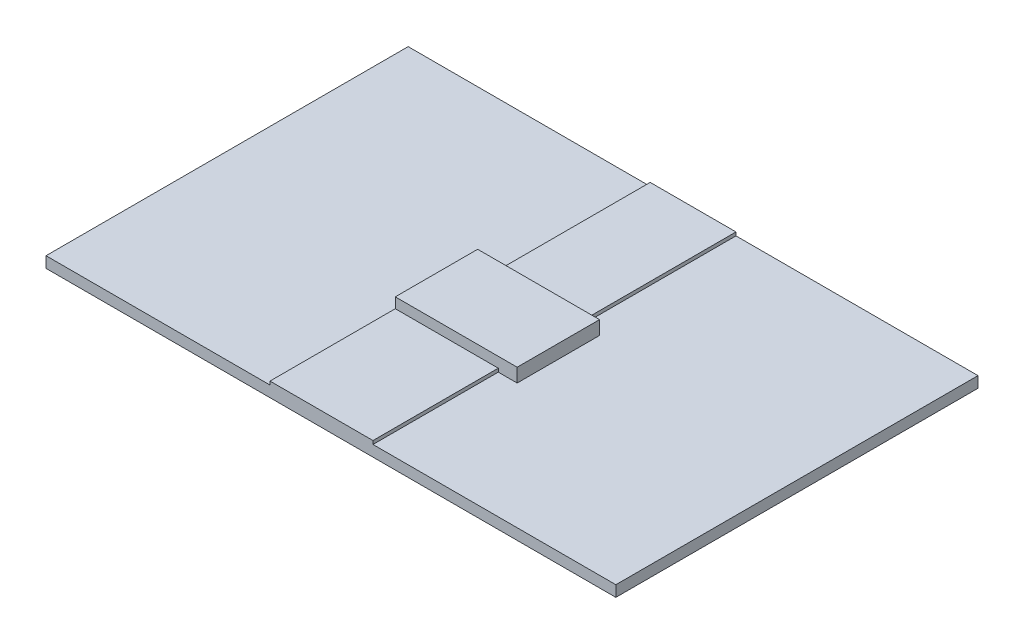
ISO-10303-21;
HEADER;
FILE_DESCRIPTION(('STEP AP214'),'2;1');
FILE_NAME('part.step','',(''),(''),'','','');
FILE_SCHEMA(('AUTOMOTIVE_DESIGN { 1 0 10303 214 1 1 1 1 }'));
ENDSEC;
DATA;
#1=APPLICATION_CONTEXT('core data for automotive mechanical design processes');
#2=APPLICATION_PROTOCOL_DEFINITION('international standard','automotive_design',2000,#1);
#3=PRODUCT_CONTEXT('',#1,'mechanical');
#4=PRODUCT('Part','Part','',(#3));
#5=PRODUCT_RELATED_PRODUCT_CATEGORY('part','',(#4));
#6=PRODUCT_DEFINITION_FORMATION('','',#4);
#7=PRODUCT_DEFINITION_CONTEXT('part definition',#1,'design');
#8=PRODUCT_DEFINITION('design','',#6,#7);
#9=PRODUCT_DEFINITION_SHAPE('','',#8);
#10=(LENGTH_UNIT() NAMED_UNIT(*) SI_UNIT(.MILLI.,.METRE.));
#11=(NAMED_UNIT(*) PLANE_ANGLE_UNIT() SI_UNIT($,.RADIAN.));
#12=(NAMED_UNIT(*) SI_UNIT($,.STERADIAN.) SOLID_ANGLE_UNIT());
#13=UNCERTAINTY_MEASURE_WITH_UNIT(LENGTH_MEASURE(1.E-05),#10,'distance_accuracy_value','');
#14=(GEOMETRIC_REPRESENTATION_CONTEXT(3) GLOBAL_UNCERTAINTY_ASSIGNED_CONTEXT((#13)) GLOBAL_UNIT_ASSIGNED_CONTEXT((#10,
#11,#12)) REPRESENTATION_CONTEXT('',''));
#15=CARTESIAN_POINT('',(0.,0.,0.));
#16=DIRECTION('',(0.,0.,1.));
#17=DIRECTION('',(1.,0.,0.));
#18=AXIS2_PLACEMENT_3D('',#15,#16,#17);
#19=CARTESIAN_POINT('',(0.,0.,0.));
#20=DIRECTION('',(0.,1.,0.));
#21=DIRECTION('',(0.,0.,1.));
#22=AXIS2_PLACEMENT_3D('',#19,#20,#21);
#23=PLANE('',#22);
#24=DIRECTION('',(1.,0.,0.));
#25=VECTOR('',#24,1.);
#26=CARTESIAN_POINT('',(0.,0.,52.75));
#27=LINE('',#26,#25);
#28=CARTESIAN_POINT('',(-83.,0.,52.75));
#29=VERTEX_POINT('',#28);
#30=CARTESIAN_POINT('',(-17.75,0.,52.75));
#31=VERTEX_POINT('',#30);
#32=EDGE_CURVE('E205',#29,#31,#27,.T.);
#33=ORIENTED_EDGE('',*,*,#32,.T.);
#34=DIRECTION('',(0.,0.,-1.));
#35=VECTOR('',#34,1.);
#36=CARTESIAN_POINT('',(-17.75,0.,0.));
#37=LINE('',#36,#35);
#38=CARTESIAN_POINT('',(-17.75,0.,-7.75));
#39=VERTEX_POINT('',#38);
#40=EDGE_CURVE('E157',#31,#39,#37,.T.);
#41=ORIENTED_EDGE('',*,*,#40,.T.);
#42=DIRECTION('',(1.,0.,0.));
#43=VECTOR('',#42,1.);
#44=CARTESIAN_POINT('',(0.,0.,-7.75));
#45=LINE('',#44,#43);
#46=CARTESIAN_POINT('',(-12.5,0.,-7.75));
#47=VERTEX_POINT('',#46);
#48=EDGE_CURVE('E251',#39,#47,#45,.T.);
#49=ORIENTED_EDGE('',*,*,#48,.T.);
#50=DIRECTION('',(0.,0.,-1.));
#51=VECTOR('',#50,1.);
#52=CARTESIAN_POINT('',(-12.5,0.,0.));
#53=LINE('',#52,#51);
#54=CARTESIAN_POINT('',(-12.5,0.,-52.75));
#55=VERTEX_POINT('',#54);
#56=EDGE_CURVE('E176',#47,#55,#53,.T.);
#57=ORIENTED_EDGE('',*,*,#56,.T.);
#58=DIRECTION('',(1.,0.,0.));
#59=VECTOR('',#58,1.);
#60=CARTESIAN_POINT('',(0.,0.,-52.75));
#61=LINE('',#60,#59);
#62=CARTESIAN_POINT('',(-83.,0.,-52.75));
#63=VERTEX_POINT('',#62);
#64=EDGE_CURVE('E217',#63,#55,#61,.T.);
#65=ORIENTED_EDGE('',*,*,#64,.F.);
#66=DIRECTION('',(0.,0.,1.));
#67=VECTOR('',#66,1.);
#68=CARTESIAN_POINT('',(-83.,0.,0.));
#69=LINE('',#68,#67);
#70=EDGE_CURVE('E220',#63,#29,#69,.T.);
#71=ORIENTED_EDGE('',*,*,#70,.T.);
#72=EDGE_LOOP('',(#33,#41,#49,#57,#65,#71));
#73=FACE_BOUND('',#72,.T.);
#74=ADVANCED_FACE('F40',(#73),#23,.T.);
#75=CARTESIAN_POINT('',(0.,4.,16.25));
#76=DIRECTION('',(0.,0.,-1.));
#77=DIRECTION('',(-1.,0.,0.));
#78=AXIS2_PLACEMENT_3D('',#75,#76,#77);
#79=PLANE('',#78);
#80=DIRECTION('',(1.,0.,0.));
#81=VECTOR('',#80,1.);
#82=CARTESIAN_POINT('',(0.,1.,16.25));
#83=LINE('',#82,#81);
#84=CARTESIAN_POINT('',(-17.75,1.,16.25));
#85=VERTEX_POINT('',#84);
#86=CARTESIAN_POINT('',(12.25,1.,16.25));
#87=VERTEX_POINT('',#86);
#88=EDGE_CURVE('E55',#85,#87,#83,.T.);
#89=ORIENTED_EDGE('',*,*,#88,.T.);
#90=DIRECTION('',(0.,-1.,0.));
#91=VECTOR('',#90,1.);
#92=CARTESIAN_POINT('',(12.25,1.,16.25));
#93=LINE('',#92,#91);
#94=CARTESIAN_POINT('',(12.25,0.,16.25));
#95=VERTEX_POINT('',#94);
#96=EDGE_CURVE('E161',#87,#95,#93,.T.);
#97=ORIENTED_EDGE('',*,*,#96,.T.);
#98=DIRECTION('',(1.,0.,0.));
#99=VECTOR('',#98,1.);
#100=CARTESIAN_POINT('',(0.,0.,16.25));
#101=LINE('',#100,#99);
#102=CARTESIAN_POINT('',(17.75,0.,16.25));
#103=VERTEX_POINT('',#102);
#104=EDGE_CURVE('E228',#95,#103,#101,.T.);
#105=ORIENTED_EDGE('',*,*,#104,.T.);
#106=DIRECTION('',(0.,-1.,0.));
#107=VECTOR('',#106,1.);
#108=CARTESIAN_POINT('',(17.75,4.,16.25));
#109=LINE('',#108,#107);
#110=CARTESIAN_POINT('',(17.75,4.,16.25));
#111=VERTEX_POINT('',#110);
#112=EDGE_CURVE('E11',#111,#103,#109,.T.);
#113=ORIENTED_EDGE('',*,*,#112,.F.);
#114=DIRECTION('',(1.,0.,0.));
#115=VECTOR('',#114,1.);
#116=CARTESIAN_POINT('',(0.,4.,16.25));
#117=LINE('',#116,#115);
#118=CARTESIAN_POINT('',(-17.75,4.,16.25));
#119=VERTEX_POINT('',#118);
#120=EDGE_CURVE('E235',#119,#111,#117,.T.);
#121=ORIENTED_EDGE('',*,*,#120,.F.);
#122=DIRECTION('',(0.,-1.,0.));
#123=VECTOR('',#122,1.);
#124=CARTESIAN_POINT('',(-17.75,4.,16.25));
#125=LINE('',#124,#123);
#126=EDGE_CURVE('E60',#119,#85,#125,.T.);
#127=ORIENTED_EDGE('',*,*,#126,.T.);
#128=EDGE_LOOP('',(#89,#97,#105,#113,#121,#127));
#129=FACE_BOUND('',#128,.T.);
#130=ADVANCED_FACE('F42',(#129),#79,.F.);
#131=CARTESIAN_POINT('',(17.75,4.,0.));
#132=DIRECTION('',(-1.,0.,0.));
#133=DIRECTION('',(0.,0.,1.));
#134=AXIS2_PLACEMENT_3D('',#131,#132,#133);
#135=PLANE('',#134);
#136=DIRECTION('',(0.,0.,-1.));
#137=VECTOR('',#136,1.);
#138=CARTESIAN_POINT('',(17.75,0.,0.));
#139=LINE('',#138,#137);
#140=CARTESIAN_POINT('',(17.75,0.,-7.75));
#141=VERTEX_POINT('',#140);
#142=EDGE_CURVE('E247',#103,#141,#139,.T.);
#143=ORIENTED_EDGE('',*,*,#142,.T.);
#144=DIRECTION('',(0.,-1.,0.));
#145=VECTOR('',#144,1.);
#146=CARTESIAN_POINT('',(17.75,4.,-7.75));
#147=LINE('',#146,#145);
#148=CARTESIAN_POINT('',(17.75,4.,-7.75));
#149=VERTEX_POINT('',#148);
#150=EDGE_CURVE('E48',#149,#141,#147,.T.);
#151=ORIENTED_EDGE('',*,*,#150,.F.);
#152=DIRECTION('',(0.,0.,-1.));
#153=VECTOR('',#152,1.);
#154=CARTESIAN_POINT('',(17.75,4.,0.));
#155=LINE('',#154,#153);
#156=EDGE_CURVE('E238',#111,#149,#155,.T.);
#157=ORIENTED_EDGE('',*,*,#156,.F.);
#158=ORIENTED_EDGE('',*,*,#112,.T.);
#159=EDGE_LOOP('',(#143,#151,#157,#158));
#160=FACE_BOUND('',#159,.T.);
#161=ADVANCED_FACE('F266',(#160),#135,.F.);
#162=CARTESIAN_POINT('',(0.,4.,-7.75));
#163=DIRECTION('',(0.,0.,-1.));
#164=DIRECTION('',(-1.,0.,0.));
#165=AXIS2_PLACEMENT_3D('',#162,#163,#164);
#166=PLANE('',#165);
#167=DIRECTION('',(0.,-1.,0.));
#168=VECTOR('',#167,1.);
#169=CARTESIAN_POINT('',(-12.5,1.,-7.75));
#170=LINE('',#169,#168);
#171=CARTESIAN_POINT('',(-12.5,1.,-7.75));
#172=VERTEX_POINT('',#171);
#173=EDGE_CURVE('E198',#172,#47,#170,.T.);
#174=ORIENTED_EDGE('',*,*,#173,.T.);
#175=ORIENTED_EDGE('',*,*,#48,.F.);
#176=DIRECTION('',(0.,-1.,0.));
#177=VECTOR('',#176,1.);
#178=CARTESIAN_POINT('',(-17.75,4.,-7.75));
#179=LINE('',#178,#177);
#180=CARTESIAN_POINT('',(-17.75,4.,-7.75));
#181=VERTEX_POINT('',#180);
#182=EDGE_CURVE('E256',#181,#39,#179,.T.);
#183=ORIENTED_EDGE('',*,*,#182,.F.);
#184=DIRECTION('',(1.,0.,0.));
#185=VECTOR('',#184,1.);
#186=CARTESIAN_POINT('',(0.,4.,-7.75));
#187=LINE('',#186,#185);
#188=EDGE_CURVE('E240',#181,#149,#187,.T.);
#189=ORIENTED_EDGE('',*,*,#188,.T.);
#190=ORIENTED_EDGE('',*,*,#150,.T.);
#191=CARTESIAN_POINT('',(12.5,0.,-7.75));
#192=VERTEX_POINT('',#191);
#193=EDGE_CURVE('E250',#192,#141,#45,.T.);
#194=ORIENTED_EDGE('',*,*,#193,.F.);
#195=DIRECTION('',(0.,-1.,0.));
#196=VECTOR('',#195,1.);
#197=CARTESIAN_POINT('',(12.5,1.,-7.75));
#198=LINE('',#197,#196);
#199=CARTESIAN_POINT('',(12.5,1.,-7.75));
#200=VERTEX_POINT('',#199);
#201=EDGE_CURVE('E196',#200,#192,#198,.T.);
#202=ORIENTED_EDGE('',*,*,#201,.F.);
#203=DIRECTION('',(1.,0.,0.));
#204=VECTOR('',#203,1.);
#205=CARTESIAN_POINT('',(0.,1.,-7.75));
#206=LINE('',#205,#204);
#207=EDGE_CURVE('E180',#172,#200,#206,.T.);
#208=ORIENTED_EDGE('',*,*,#207,.F.);
#209=EDGE_LOOP('',(#174,#175,#183,#189,#190,#194,#202,#208));
#210=FACE_BOUND('',#209,.T.);
#211=ADVANCED_FACE('F261',(#210),#166,.T.);
#212=CARTESIAN_POINT('',(-17.75,4.,0.));
#213=DIRECTION('',(-1.,0.,0.));
#214=DIRECTION('',(0.,0.,1.));
#215=AXIS2_PLACEMENT_3D('',#212,#213,#214);
#216=PLANE('',#215);
#217=ORIENTED_EDGE('',*,*,#40,.F.);
#218=DIRECTION('',(0.,-1.,0.));
#219=VECTOR('',#218,1.);
#220=CARTESIAN_POINT('',(-17.75,1.,52.75));
#221=LINE('',#220,#219);
#222=CARTESIAN_POINT('',(-17.75,1.,52.75));
#223=VERTEX_POINT('',#222);
#224=EDGE_CURVE('E154',#223,#31,#221,.T.);
#225=ORIENTED_EDGE('',*,*,#224,.F.);
#226=DIRECTION('',(0.,0.,1.));
#227=VECTOR('',#226,1.);
#228=CARTESIAN_POINT('',(-17.75,1.,0.));
#229=LINE('',#228,#227);
#230=EDGE_CURVE('E144',#85,#223,#229,.T.);
#231=ORIENTED_EDGE('',*,*,#230,.F.);
#232=ORIENTED_EDGE('',*,*,#126,.F.);
#233=DIRECTION('',(0.,0.,-1.));
#234=VECTOR('',#233,1.);
#235=CARTESIAN_POINT('',(-17.75,4.,0.));
#236=LINE('',#235,#234);
#237=EDGE_CURVE('E243',#119,#181,#236,.T.);
#238=ORIENTED_EDGE('',*,*,#237,.T.);
#239=ORIENTED_EDGE('',*,*,#182,.T.);
#240=EDGE_LOOP('',(#217,#225,#231,#232,#238,#239));
#241=FACE_BOUND('',#240,.T.);
#242=ADVANCED_FACE('F155',(#241),#216,.T.);
#243=CARTESIAN_POINT('',(0.,4.,0.));
#244=DIRECTION('',(0.,1.,0.));
#245=DIRECTION('',(0.,0.,1.));
#246=AXIS2_PLACEMENT_3D('',#243,#244,#245);
#247=PLANE('',#246);
#248=ORIENTED_EDGE('',*,*,#120,.T.);
#249=ORIENTED_EDGE('',*,*,#156,.T.);
#250=ORIENTED_EDGE('',*,*,#188,.F.);
#251=ORIENTED_EDGE('',*,*,#237,.F.);
#252=EDGE_LOOP('',(#248,#249,#250,#251));
#253=FACE_BOUND('',#252,.T.);
#254=ADVANCED_FACE('F293',(#253),#247,.T.);
#255=DIRECTION('',(0.,0.,1.));
#256=VECTOR('',#255,1.);
#257=CARTESIAN_POINT('',(12.25,0.,0.));
#258=LINE('',#257,#256);
#259=CARTESIAN_POINT('',(12.25,0.,52.75));
#260=VERTEX_POINT('',#259);
#261=EDGE_CURVE('E171',#95,#260,#258,.T.);
#262=ORIENTED_EDGE('',*,*,#261,.T.);
#263=CARTESIAN_POINT('',(83.,0.,52.75));
#264=VERTEX_POINT('',#263);
#265=EDGE_CURVE('E223',#260,#264,#27,.T.);
#266=ORIENTED_EDGE('',*,*,#265,.T.);
#267=DIRECTION('',(0.,0.,1.));
#268=VECTOR('',#267,1.);
#269=CARTESIAN_POINT('',(83.,0.,0.));
#270=LINE('',#269,#268);
#271=CARTESIAN_POINT('',(83.,0.,-52.75));
#272=VERTEX_POINT('',#271);
#273=EDGE_CURVE('E201',#272,#264,#270,.T.);
#274=ORIENTED_EDGE('',*,*,#273,.F.);
#275=CARTESIAN_POINT('',(12.5,0.,-52.75));
#276=VERTEX_POINT('',#275);
#277=EDGE_CURVE('E216',#276,#272,#61,.T.);
#278=ORIENTED_EDGE('',*,*,#277,.F.);
#279=DIRECTION('',(0.,0.,-1.));
#280=VECTOR('',#279,1.);
#281=CARTESIAN_POINT('',(12.5,0.,0.));
#282=LINE('',#281,#280);
#283=EDGE_CURVE('E181',#192,#276,#282,.T.);
#284=ORIENTED_EDGE('',*,*,#283,.F.);
#285=ORIENTED_EDGE('',*,*,#193,.T.);
#286=ORIENTED_EDGE('',*,*,#142,.F.);
#287=ORIENTED_EDGE('',*,*,#104,.F.);
#288=EDGE_LOOP('',(#262,#266,#274,#278,#284,#285,#286,#287));
#289=FACE_BOUND('',#288,.T.);
#290=ADVANCED_FACE('F270',(#289),#23,.T.);
#291=CARTESIAN_POINT('',(83.,-3.2,0.));
#292=DIRECTION('',(-1.,0.,0.));
#293=DIRECTION('',(0.,0.,1.));
#294=AXIS2_PLACEMENT_3D('',#291,#292,#293);
#295=PLANE('',#294);
#296=ORIENTED_EDGE('',*,*,#273,.T.);
#297=DIRECTION('',(0.,1.,0.));
#298=VECTOR('',#297,1.);
#299=CARTESIAN_POINT('',(83.,-3.2,52.75));
#300=LINE('',#299,#298);
#301=CARTESIAN_POINT('',(83.,-3.2,52.75));
#302=VERTEX_POINT('',#301);
#303=EDGE_CURVE('E225',#302,#264,#300,.T.);
#304=ORIENTED_EDGE('',*,*,#303,.F.);
#305=DIRECTION('',(0.,0.,1.));
#306=VECTOR('',#305,1.);
#307=CARTESIAN_POINT('',(83.,-3.2,0.));
#308=LINE('',#307,#306);
#309=CARTESIAN_POINT('',(83.,-3.2,-52.75));
#310=VERTEX_POINT('',#309);
#311=EDGE_CURVE('E202',#310,#302,#308,.T.);
#312=ORIENTED_EDGE('',*,*,#311,.F.);
#313=DIRECTION('',(0.,1.,0.));
#314=VECTOR('',#313,1.);
#315=CARTESIAN_POINT('',(83.,-3.2,-52.75));
#316=LINE('',#315,#314);
#317=EDGE_CURVE('E213',#310,#272,#316,.T.);
#318=ORIENTED_EDGE('',*,*,#317,.T.);
#319=EDGE_LOOP('',(#296,#304,#312,#318));
#320=FACE_BOUND('',#319,.T.);
#321=ADVANCED_FACE('F301',(#320),#295,.F.);
#322=CARTESIAN_POINT('',(0.,-3.2,52.75));
#323=DIRECTION('',(0.,0.,1.));
#324=DIRECTION('',(1.,0.,0.));
#325=AXIS2_PLACEMENT_3D('',#322,#323,#324);
#326=PLANE('',#325);
#327=ORIENTED_EDGE('',*,*,#32,.F.);
#328=DIRECTION('',(0.,1.,0.));
#329=VECTOR('',#328,1.);
#330=CARTESIAN_POINT('',(-83.,-3.2,52.75));
#331=LINE('',#330,#329);
#332=CARTESIAN_POINT('',(-83.,-3.2,52.75));
#333=VERTEX_POINT('',#332);
#334=EDGE_CURVE('E229',#333,#29,#331,.T.);
#335=ORIENTED_EDGE('',*,*,#334,.F.);
#336=DIRECTION('',(1.,0.,0.));
#337=VECTOR('',#336,1.);
#338=CARTESIAN_POINT('',(0.,-3.2,52.75));
#339=LINE('',#338,#337);
#340=EDGE_CURVE('E210',#333,#302,#339,.T.);
#341=ORIENTED_EDGE('',*,*,#340,.T.);
#342=ORIENTED_EDGE('',*,*,#303,.T.);
#343=ORIENTED_EDGE('',*,*,#265,.F.);
#344=DIRECTION('',(0.,-1.,0.));
#345=VECTOR('',#344,1.);
#346=CARTESIAN_POINT('',(12.25,1.,52.75));
#347=LINE('',#346,#345);
#348=CARTESIAN_POINT('',(12.25,1.,52.75));
#349=VERTEX_POINT('',#348);
#350=EDGE_CURVE('E162',#349,#260,#347,.T.);
#351=ORIENTED_EDGE('',*,*,#350,.F.);
#352=DIRECTION('',(1.,0.,0.));
#353=VECTOR('',#352,1.);
#354=CARTESIAN_POINT('',(0.,1.,52.75));
#355=LINE('',#354,#353);
#356=EDGE_CURVE('E149',#223,#349,#355,.T.);
#357=ORIENTED_EDGE('',*,*,#356,.F.);
#358=ORIENTED_EDGE('',*,*,#224,.T.);
#359=EDGE_LOOP('',(#327,#335,#341,#342,#343,#351,#357,#358));
#360=FACE_BOUND('',#359,.T.);
#361=ADVANCED_FACE('F164',(#360),#326,.T.);
#362=CARTESIAN_POINT('',(-83.,-3.2,0.));
#363=DIRECTION('',(-1.,0.,0.));
#364=DIRECTION('',(0.,0.,1.));
#365=AXIS2_PLACEMENT_3D('',#362,#363,#364);
#366=PLANE('',#365);
#367=ORIENTED_EDGE('',*,*,#70,.F.);
#368=DIRECTION('',(0.,1.,0.));
#369=VECTOR('',#368,1.);
#370=CARTESIAN_POINT('',(-83.,-3.2,-52.75));
#371=LINE('',#370,#369);
#372=CARTESIAN_POINT('',(-83.,-3.2,-52.75));
#373=VERTEX_POINT('',#372);
#374=EDGE_CURVE('E231',#373,#63,#371,.T.);
#375=ORIENTED_EDGE('',*,*,#374,.F.);
#376=DIRECTION('',(0.,0.,1.));
#377=VECTOR('',#376,1.);
#378=CARTESIAN_POINT('',(-83.,-3.2,0.));
#379=LINE('',#378,#377);
#380=EDGE_CURVE('E207',#373,#333,#379,.T.);
#381=ORIENTED_EDGE('',*,*,#380,.T.);
#382=ORIENTED_EDGE('',*,*,#334,.T.);
#383=EDGE_LOOP('',(#367,#375,#381,#382));
#384=FACE_BOUND('',#383,.T.);
#385=ADVANCED_FACE('F308',(#384),#366,.T.);
#386=CARTESIAN_POINT('',(0.,-3.2,-52.75));
#387=DIRECTION('',(0.,0.,1.));
#388=DIRECTION('',(1.,0.,0.));
#389=AXIS2_PLACEMENT_3D('',#386,#387,#388);
#390=PLANE('',#389);
#391=ORIENTED_EDGE('',*,*,#64,.T.);
#392=DIRECTION('',(0.,-1.,0.));
#393=VECTOR('',#392,1.);
#394=CARTESIAN_POINT('',(-12.5,1.,-52.75));
#395=LINE('',#394,#393);
#396=CARTESIAN_POINT('',(-12.5,1.,-52.75));
#397=VERTEX_POINT('',#396);
#398=EDGE_CURVE('E188',#397,#55,#395,.T.);
#399=ORIENTED_EDGE('',*,*,#398,.F.);
#400=DIRECTION('',(1.,0.,0.));
#401=VECTOR('',#400,1.);
#402=CARTESIAN_POINT('',(0.,1.,-52.75));
#403=LINE('',#402,#401);
#404=CARTESIAN_POINT('',(12.5,1.,-52.75));
#405=VERTEX_POINT('',#404);
#406=EDGE_CURVE('E185',#397,#405,#403,.T.);
#407=ORIENTED_EDGE('',*,*,#406,.T.);
#408=DIRECTION('',(0.,-1.,0.));
#409=VECTOR('',#408,1.);
#410=CARTESIAN_POINT('',(12.5,1.,-52.75));
#411=LINE('',#410,#409);
#412=EDGE_CURVE('E193',#405,#276,#411,.T.);
#413=ORIENTED_EDGE('',*,*,#412,.T.);
#414=ORIENTED_EDGE('',*,*,#277,.T.);
#415=ORIENTED_EDGE('',*,*,#317,.F.);
#416=DIRECTION('',(1.,0.,0.));
#417=VECTOR('',#416,1.);
#418=CARTESIAN_POINT('',(0.,-3.2,-52.75));
#419=LINE('',#418,#417);
#420=EDGE_CURVE('E204',#373,#310,#419,.T.);
#421=ORIENTED_EDGE('',*,*,#420,.F.);
#422=ORIENTED_EDGE('',*,*,#374,.T.);
#423=EDGE_LOOP('',(#391,#399,#407,#413,#414,#415,#421,#422));
#424=FACE_BOUND('',#423,.T.);
#425=ADVANCED_FACE('F280',(#424),#390,.F.);
#426=CARTESIAN_POINT('',(0.,-3.2,0.));
#427=DIRECTION('',(0.,1.,0.));
#428=DIRECTION('',(0.,0.,1.));
#429=AXIS2_PLACEMENT_3D('',#426,#427,#428);
#430=PLANE('',#429);
#431=ORIENTED_EDGE('',*,*,#311,.T.);
#432=ORIENTED_EDGE('',*,*,#340,.F.);
#433=ORIENTED_EDGE('',*,*,#380,.F.);
#434=ORIENTED_EDGE('',*,*,#420,.T.);
#435=EDGE_LOOP('',(#431,#432,#433,#434));
#436=FACE_BOUND('',#435,.T.);
#437=ADVANCED_FACE('F305',(#436),#430,.F.);
#438=CARTESIAN_POINT('',(-12.5,1.,0.));
#439=DIRECTION('',(-1.,0.,0.));
#440=DIRECTION('',(0.,0.,1.));
#441=AXIS2_PLACEMENT_3D('',#438,#439,#440);
#442=PLANE('',#441);
#443=ORIENTED_EDGE('',*,*,#56,.F.);
#444=ORIENTED_EDGE('',*,*,#173,.F.);
#445=DIRECTION('',(0.,0.,-1.));
#446=VECTOR('',#445,1.);
#447=CARTESIAN_POINT('',(-12.5,1.,0.));
#448=LINE('',#447,#446);
#449=EDGE_CURVE('E177',#172,#397,#448,.T.);
#450=ORIENTED_EDGE('',*,*,#449,.T.);
#451=ORIENTED_EDGE('',*,*,#398,.T.);
#452=EDGE_LOOP('',(#443,#444,#450,#451));
#453=FACE_BOUND('',#452,.T.);
#454=ADVANCED_FACE('F379',(#453),#442,.T.);
#455=CARTESIAN_POINT('',(12.5,1.,0.));
#456=DIRECTION('',(-1.,0.,0.));
#457=DIRECTION('',(0.,0.,1.));
#458=AXIS2_PLACEMENT_3D('',#455,#456,#457);
#459=PLANE('',#458);
#460=ORIENTED_EDGE('',*,*,#283,.T.);
#461=ORIENTED_EDGE('',*,*,#412,.F.);
#462=DIRECTION('',(0.,0.,-1.));
#463=VECTOR('',#462,1.);
#464=CARTESIAN_POINT('',(12.5,1.,0.));
#465=LINE('',#464,#463);
#466=EDGE_CURVE('E183',#200,#405,#465,.T.);
#467=ORIENTED_EDGE('',*,*,#466,.F.);
#468=ORIENTED_EDGE('',*,*,#201,.T.);
#469=EDGE_LOOP('',(#460,#461,#467,#468));
#470=FACE_BOUND('',#469,.T.);
#471=ADVANCED_FACE('F277',(#470),#459,.F.);
#472=CARTESIAN_POINT('',(0.,1.,0.));
#473=DIRECTION('',(0.,1.,0.));
#474=DIRECTION('',(0.,0.,1.));
#475=AXIS2_PLACEMENT_3D('',#472,#473,#474);
#476=PLANE('',#475);
#477=ORIENTED_EDGE('',*,*,#449,.F.);
#478=ORIENTED_EDGE('',*,*,#207,.T.);
#479=ORIENTED_EDGE('',*,*,#466,.T.);
#480=ORIENTED_EDGE('',*,*,#406,.F.);
#481=EDGE_LOOP('',(#477,#478,#479,#480));
#482=FACE_BOUND('',#481,.T.);
#483=ADVANCED_FACE('F285',(#482),#476,.T.);
#484=CARTESIAN_POINT('',(12.25,1.,0.));
#485=DIRECTION('',(1.,0.,0.));
#486=DIRECTION('',(0.,0.,-1.));
#487=AXIS2_PLACEMENT_3D('',#484,#485,#486);
#488=PLANE('',#487);
#489=ORIENTED_EDGE('',*,*,#261,.F.);
#490=ORIENTED_EDGE('',*,*,#96,.F.);
#491=DIRECTION('',(0.,0.,1.));
#492=VECTOR('',#491,1.);
#493=CARTESIAN_POINT('',(12.25,1.,0.));
#494=LINE('',#493,#492);
#495=EDGE_CURVE('E173',#87,#349,#494,.T.);
#496=ORIENTED_EDGE('',*,*,#495,.T.);
#497=ORIENTED_EDGE('',*,*,#350,.T.);
#498=EDGE_LOOP('',(#489,#490,#496,#497));
#499=FACE_BOUND('',#498,.T.);
#500=ADVANCED_FACE('F295',(#499),#488,.T.);
#501=CARTESIAN_POINT('',(0.,1.,0.));
#502=DIRECTION('',(0.,1.,0.));
#503=DIRECTION('',(0.,0.,1.));
#504=AXIS2_PLACEMENT_3D('',#501,#502,#503);
#505=PLANE('',#504);
#506=ORIENTED_EDGE('',*,*,#495,.F.);
#507=ORIENTED_EDGE('',*,*,#88,.F.);
#508=ORIENTED_EDGE('',*,*,#230,.T.);
#509=ORIENTED_EDGE('',*,*,#356,.T.);
#510=EDGE_LOOP('',(#506,#507,#508,#509));
#511=FACE_BOUND('',#510,.T.);
#512=ADVANCED_FACE('F147',(#511),#505,.T.);
#513=CLOSED_SHELL('',(#74,#130,#161,#211,#242,#254,#290,#321,#361,#385,#425,#437,#454,#471,#483,
#500,#512));
#514=MANIFOLD_SOLID_BREP('B2',#513);
#515=ADVANCED_BREP_SHAPE_REPRESENTATION('',(#18,#514),#14);
#516=SHAPE_DEFINITION_REPRESENTATION(#9,#515);
ENDSEC;
END-ISO-10303-21;
